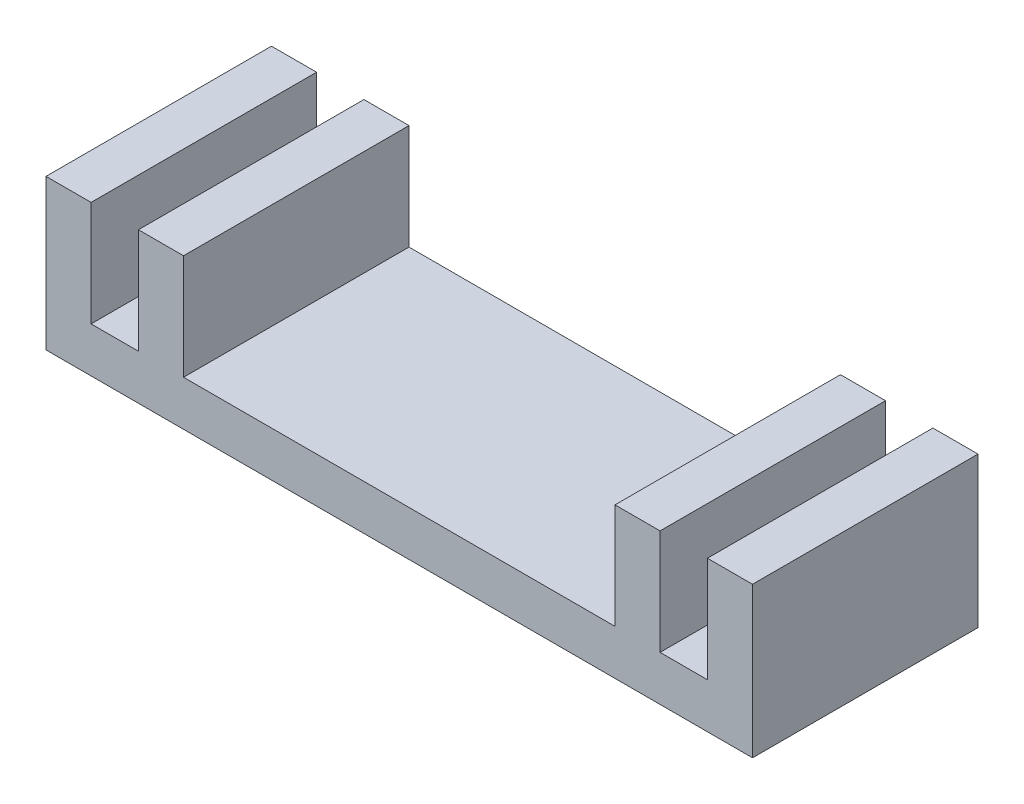
ISO-10303-21;
HEADER;
FILE_DESCRIPTION(('STEP AP214'),'2;1');
FILE_NAME('part.step','',(''),(''),'','','');
FILE_SCHEMA(('AUTOMOTIVE_DESIGN { 1 0 10303 214 1 1 1 1 }'));
ENDSEC;
DATA;
#1=APPLICATION_CONTEXT('core data for automotive mechanical design processes');
#2=APPLICATION_PROTOCOL_DEFINITION('international standard','automotive_design',2000,#1);
#3=PRODUCT_CONTEXT('',#1,'mechanical');
#4=PRODUCT('Part','Part','',(#3));
#5=PRODUCT_RELATED_PRODUCT_CATEGORY('part','',(#4));
#6=PRODUCT_DEFINITION_FORMATION('','',#4);
#7=PRODUCT_DEFINITION_CONTEXT('part definition',#1,'design');
#8=PRODUCT_DEFINITION('design','',#6,#7);
#9=PRODUCT_DEFINITION_SHAPE('','',#8);
#10=(LENGTH_UNIT() NAMED_UNIT(*) SI_UNIT(.MILLI.,.METRE.));
#11=(NAMED_UNIT(*) PLANE_ANGLE_UNIT() SI_UNIT($,.RADIAN.));
#12=(NAMED_UNIT(*) SI_UNIT($,.STERADIAN.) SOLID_ANGLE_UNIT());
#13=UNCERTAINTY_MEASURE_WITH_UNIT(LENGTH_MEASURE(1.E-05),#10,'distance_accuracy_value','');
#14=(GEOMETRIC_REPRESENTATION_CONTEXT(3) GLOBAL_UNCERTAINTY_ASSIGNED_CONTEXT((#13)) GLOBAL_UNIT_ASSIGNED_CONTEXT((#10,
#11,#12)) REPRESENTATION_CONTEXT('',''));
#15=CARTESIAN_POINT('',(0.,0.,0.));
#16=DIRECTION('',(0.,0.,1.));
#17=DIRECTION('',(1.,0.,0.));
#18=AXIS2_PLACEMENT_3D('',#15,#16,#17);
#19=CARTESIAN_POINT('',(-17.35,9.99999999999999,15.));
#20=DIRECTION('',(0.,-1.,0.));
#21=DIRECTION('',(0.,0.,-1.));
#22=AXIS2_PLACEMENT_3D('',#19,#20,#21);
#23=PLANE('',#22);
#24=DIRECTION('',(-1.,0.,0.));
#25=VECTOR('',#24,1.);
#26=CARTESIAN_POINT('',(-17.35,9.99999999999999,0.));
#27=LINE('',#26,#25);
#28=CARTESIAN_POINT('',(-14.3511570436131,9.99999999999999,0.));
#29=VERTEX_POINT('',#28);
#30=CARTESIAN_POINT('',(-17.35,9.99999999999999,0.));
#31=VERTEX_POINT('',#30);
#32=EDGE_CURVE('E181',#29,#31,#27,.T.);
#33=ORIENTED_EDGE('',*,*,#32,.T.);
#34=DIRECTION('',(0.,0.,-1.));
#35=VECTOR('',#34,1.);
#36=CARTESIAN_POINT('',(-17.35,9.99999999999999,15.));
#37=LINE('',#36,#35);
#38=CARTESIAN_POINT('',(-17.35,9.99999999999999,15.));
#39=VERTEX_POINT('',#38);
#40=EDGE_CURVE('E11',#39,#31,#37,.T.);
#41=ORIENTED_EDGE('',*,*,#40,.F.);
#42=DIRECTION('',(-1.,0.,0.));
#43=VECTOR('',#42,1.);
#44=CARTESIAN_POINT('',(-17.35,9.99999999999999,15.));
#45=LINE('',#44,#43);
#46=CARTESIAN_POINT('',(-14.3511570436131,9.99999999999999,15.));
#47=VERTEX_POINT('',#46);
#48=EDGE_CURVE('E212',#47,#39,#45,.T.);
#49=ORIENTED_EDGE('',*,*,#48,.F.);
#50=DIRECTION('',(0.,0.,-1.));
#51=VECTOR('',#50,1.);
#52=CARTESIAN_POINT('',(-14.3511570436131,9.99999999999999,15.));
#53=LINE('',#52,#51);
#54=EDGE_CURVE('E177',#47,#29,#53,.T.);
#55=ORIENTED_EDGE('',*,*,#54,.T.);
#56=EDGE_LOOP('',(#33,#41,#49,#55));
#57=FACE_BOUND('',#56,.T.);
#58=ADVANCED_FACE('F37',(#57),#23,.F.);
#59=CARTESIAN_POINT('',(-17.35,2.99999999999999,15.));
#60=DIRECTION('',(1.,0.,0.));
#61=DIRECTION('',(0.,0.,-1.));
#62=AXIS2_PLACEMENT_3D('',#59,#60,#61);
#63=PLANE('',#62);
#64=DIRECTION('',(0.,-1.,0.));
#65=VECTOR('',#64,1.);
#66=CARTESIAN_POINT('',(-17.35,2.99999999999999,0.));
#67=LINE('',#66,#65);
#68=CARTESIAN_POINT('',(-17.35,2.99999999999999,0.));
#69=VERTEX_POINT('',#68);
#70=EDGE_CURVE('E184',#31,#69,#67,.T.);
#71=ORIENTED_EDGE('',*,*,#70,.T.);
#72=DIRECTION('',(0.,0.,-1.));
#73=VECTOR('',#72,1.);
#74=CARTESIAN_POINT('',(-17.35,2.99999999999999,15.));
#75=LINE('',#74,#73);
#76=CARTESIAN_POINT('',(-17.35,2.99999999999999,15.));
#77=VERTEX_POINT('',#76);
#78=EDGE_CURVE('E45',#77,#69,#75,.T.);
#79=ORIENTED_EDGE('',*,*,#78,.F.);
#80=DIRECTION('',(0.,-1.,0.));
#81=VECTOR('',#80,1.);
#82=CARTESIAN_POINT('',(-17.35,2.99999999999999,15.));
#83=LINE('',#82,#81);
#84=EDGE_CURVE('E120',#39,#77,#83,.T.);
#85=ORIENTED_EDGE('',*,*,#84,.F.);
#86=ORIENTED_EDGE('',*,*,#40,.T.);
#87=EDGE_LOOP('',(#71,#79,#85,#86));
#88=FACE_BOUND('',#87,.T.);
#89=ADVANCED_FACE('F310',(#88),#63,.F.);
#90=CARTESIAN_POINT('',(-20.5,3.,15.));
#91=DIRECTION('',(0.,-1.,0.));
#92=DIRECTION('',(1.,0.,0.));
#93=AXIS2_PLACEMENT_3D('',#90,#91,#92);
#94=PLANE('',#93);
#95=DIRECTION('',(-1.,0.,0.));
#96=VECTOR('',#95,1.);
#97=CARTESIAN_POINT('',(-20.5,3.,0.));
#98=LINE('',#97,#96);
#99=CARTESIAN_POINT('',(-20.5,3.,0.));
#100=VERTEX_POINT('',#99);
#101=EDGE_CURVE('E186',#69,#100,#98,.T.);
#102=ORIENTED_EDGE('',*,*,#101,.T.);
#103=DIRECTION('',(0.,0.,-1.));
#104=VECTOR('',#103,1.);
#105=CARTESIAN_POINT('',(-20.5,3.,15.));
#106=LINE('',#105,#104);
#107=CARTESIAN_POINT('',(-20.5,3.,15.));
#108=VERTEX_POINT('',#107);
#109=EDGE_CURVE('E243',#108,#100,#106,.T.);
#110=ORIENTED_EDGE('',*,*,#109,.F.);
#111=DIRECTION('',(-1.,0.,0.));
#112=VECTOR('',#111,1.);
#113=CARTESIAN_POINT('',(-20.5,3.,15.));
#114=LINE('',#113,#112);
#115=EDGE_CURVE('E251',#77,#108,#114,.T.);
#116=ORIENTED_EDGE('',*,*,#115,.F.);
#117=ORIENTED_EDGE('',*,*,#78,.T.);
#118=EDGE_LOOP('',(#102,#110,#116,#117));
#119=FACE_BOUND('',#118,.T.);
#120=ADVANCED_FACE('F249',(#119),#94,.F.);
#121=CARTESIAN_POINT('',(-20.5,10.,15.));
#122=DIRECTION('',(-1.,0.,0.));
#123=DIRECTION('',(0.,0.,1.));
#124=AXIS2_PLACEMENT_3D('',#121,#122,#123);
#125=PLANE('',#124);
#126=DIRECTION('',(0.,1.,0.));
#127=VECTOR('',#126,1.);
#128=CARTESIAN_POINT('',(-20.5,10.,0.));
#129=LINE('',#128,#127);
#130=CARTESIAN_POINT('',(-20.5,10.,0.));
#131=VERTEX_POINT('',#130);
#132=EDGE_CURVE('E188',#100,#131,#129,.T.);
#133=ORIENTED_EDGE('',*,*,#132,.T.);
#134=DIRECTION('',(0.,0.,-1.));
#135=VECTOR('',#134,1.);
#136=CARTESIAN_POINT('',(-20.5,10.,15.));
#137=LINE('',#136,#135);
#138=CARTESIAN_POINT('',(-20.5,10.,15.));
#139=VERTEX_POINT('',#138);
#140=EDGE_CURVE('E240',#139,#131,#137,.T.);
#141=ORIENTED_EDGE('',*,*,#140,.F.);
#142=DIRECTION('',(0.,1.,0.));
#143=VECTOR('',#142,1.);
#144=CARTESIAN_POINT('',(-20.5,10.,15.));
#145=LINE('',#144,#143);
#146=EDGE_CURVE('E269',#108,#139,#145,.T.);
#147=ORIENTED_EDGE('',*,*,#146,.F.);
#148=ORIENTED_EDGE('',*,*,#109,.T.);
#149=EDGE_LOOP('',(#133,#141,#147,#148));
#150=FACE_BOUND('',#149,.T.);
#151=ADVANCED_FACE('F260',(#150),#125,.F.);
#152=CARTESIAN_POINT('',(-23.5,10.,15.));
#153=DIRECTION('',(0.,-1.,0.));
#154=DIRECTION('',(0.,0.,-1.));
#155=AXIS2_PLACEMENT_3D('',#152,#153,#154);
#156=PLANE('',#155);
#157=DIRECTION('',(-1.,0.,0.));
#158=VECTOR('',#157,1.);
#159=CARTESIAN_POINT('',(-23.5,10.,0.));
#160=LINE('',#159,#158);
#161=CARTESIAN_POINT('',(-23.5,10.,0.));
#162=VERTEX_POINT('',#161);
#163=EDGE_CURVE('E190',#131,#162,#160,.T.);
#164=ORIENTED_EDGE('',*,*,#163,.T.);
#165=DIRECTION('',(0.,0.,-1.));
#166=VECTOR('',#165,1.);
#167=CARTESIAN_POINT('',(-23.5,10.,15.));
#168=LINE('',#167,#166);
#169=CARTESIAN_POINT('',(-23.5,10.,15.));
#170=VERTEX_POINT('',#169);
#171=EDGE_CURVE('E237',#170,#162,#168,.T.);
#172=ORIENTED_EDGE('',*,*,#171,.F.);
#173=DIRECTION('',(-1.,0.,0.));
#174=VECTOR('',#173,1.);
#175=CARTESIAN_POINT('',(-23.5,10.,15.));
#176=LINE('',#175,#174);
#177=EDGE_CURVE('E266',#139,#170,#176,.T.);
#178=ORIENTED_EDGE('',*,*,#177,.F.);
#179=ORIENTED_EDGE('',*,*,#140,.T.);
#180=EDGE_LOOP('',(#164,#172,#178,#179));
#181=FACE_BOUND('',#180,.T.);
#182=ADVANCED_FACE('F264',(#181),#156,.F.);
#183=CARTESIAN_POINT('',(-23.5,0.,15.));
#184=DIRECTION('',(1.,0.,0.));
#185=DIRECTION('',(0.,0.,-1.));
#186=AXIS2_PLACEMENT_3D('',#183,#184,#185);
#187=PLANE('',#186);
#188=DIRECTION('',(0.,-1.,0.));
#189=VECTOR('',#188,1.);
#190=CARTESIAN_POINT('',(-23.5,0.,0.));
#191=LINE('',#190,#189);
#192=CARTESIAN_POINT('',(-23.5,0.,0.));
#193=VERTEX_POINT('',#192);
#194=EDGE_CURVE('E192',#162,#193,#191,.T.);
#195=ORIENTED_EDGE('',*,*,#194,.T.);
#196=DIRECTION('',(0.,0.,-1.));
#197=VECTOR('',#196,1.);
#198=CARTESIAN_POINT('',(-23.5,0.,15.));
#199=LINE('',#198,#197);
#200=CARTESIAN_POINT('',(-23.5,0.,15.));
#201=VERTEX_POINT('',#200);
#202=EDGE_CURVE('E234',#201,#193,#199,.T.);
#203=ORIENTED_EDGE('',*,*,#202,.F.);
#204=DIRECTION('',(0.,-1.,0.));
#205=VECTOR('',#204,1.);
#206=CARTESIAN_POINT('',(-23.5,0.,15.));
#207=LINE('',#206,#205);
#208=EDGE_CURVE('E268',#170,#201,#207,.T.);
#209=ORIENTED_EDGE('',*,*,#208,.F.);
#210=ORIENTED_EDGE('',*,*,#171,.T.);
#211=EDGE_LOOP('',(#195,#203,#209,#210));
#212=FACE_BOUND('',#211,.T.);
#213=ADVANCED_FACE('F323',(#212),#187,.F.);
#214=CARTESIAN_POINT('',(20.5,0.,15.));
#215=DIRECTION('',(0.,1.,0.));
#216=DIRECTION('',(-1.,0.,0.));
#217=AXIS2_PLACEMENT_3D('',#214,#215,#216);
#218=PLANE('',#217);
#219=DIRECTION('',(1.,0.,0.));
#220=VECTOR('',#219,1.);
#221=CARTESIAN_POINT('',(20.5,0.,0.));
#222=LINE('',#221,#220);
#223=CARTESIAN_POINT('',(23.5,0.,0.));
#224=VERTEX_POINT('',#223);
#225=EDGE_CURVE('E195',#193,#224,#222,.T.);
#226=ORIENTED_EDGE('',*,*,#225,.T.);
#227=DIRECTION('',(0.,0.,-1.));
#228=VECTOR('',#227,1.);
#229=CARTESIAN_POINT('',(23.5,0.,15.));
#230=LINE('',#229,#228);
#231=CARTESIAN_POINT('',(23.5,0.,15.));
#232=VERTEX_POINT('',#231);
#233=EDGE_CURVE('E231',#232,#224,#230,.T.);
#234=ORIENTED_EDGE('',*,*,#233,.F.);
#235=DIRECTION('',(1.,0.,0.));
#236=VECTOR('',#235,1.);
#237=CARTESIAN_POINT('',(-20.5,0.,15.));
#238=LINE('',#237,#236);
#239=EDGE_CURVE('E271',#201,#232,#238,.T.);
#240=ORIENTED_EDGE('',*,*,#239,.F.);
#241=ORIENTED_EDGE('',*,*,#202,.T.);
#242=EDGE_LOOP('',(#226,#234,#240,#241));
#243=FACE_BOUND('',#242,.T.);
#244=ADVANCED_FACE('F326',(#243),#218,.F.);
#245=CARTESIAN_POINT('',(23.5,0.,15.));
#246=DIRECTION('',(-1.,0.,0.));
#247=DIRECTION('',(0.,0.,1.));
#248=AXIS2_PLACEMENT_3D('',#245,#246,#247);
#249=PLANE('',#248);
#250=DIRECTION('',(0.,1.,0.));
#251=VECTOR('',#250,1.);
#252=CARTESIAN_POINT('',(23.5,0.,0.));
#253=LINE('',#252,#251);
#254=CARTESIAN_POINT('',(23.5,10.,0.));
#255=VERTEX_POINT('',#254);
#256=EDGE_CURVE('E197',#224,#255,#253,.T.);
#257=ORIENTED_EDGE('',*,*,#256,.T.);
#258=DIRECTION('',(0.,0.,-1.));
#259=VECTOR('',#258,1.);
#260=CARTESIAN_POINT('',(23.5,10.,15.));
#261=LINE('',#260,#259);
#262=CARTESIAN_POINT('',(23.5,10.,15.));
#263=VERTEX_POINT('',#262);
#264=EDGE_CURVE('E228',#263,#255,#261,.T.);
#265=ORIENTED_EDGE('',*,*,#264,.F.);
#266=DIRECTION('',(0.,1.,0.));
#267=VECTOR('',#266,1.);
#268=CARTESIAN_POINT('',(23.5,0.,15.));
#269=LINE('',#268,#267);
#270=EDGE_CURVE('E277',#232,#263,#269,.T.);
#271=ORIENTED_EDGE('',*,*,#270,.F.);
#272=ORIENTED_EDGE('',*,*,#233,.T.);
#273=EDGE_LOOP('',(#257,#265,#271,#272));
#274=FACE_BOUND('',#273,.T.);
#275=ADVANCED_FACE('F330',(#274),#249,.F.);
#276=CARTESIAN_POINT('',(23.5,10.,15.));
#277=DIRECTION('',(0.,-1.,0.));
#278=DIRECTION('',(0.,0.,-1.));
#279=AXIS2_PLACEMENT_3D('',#276,#277,#278);
#280=PLANE('',#279);
#281=DIRECTION('',(-1.,0.,0.));
#282=VECTOR('',#281,1.);
#283=CARTESIAN_POINT('',(23.5,10.,0.));
#284=LINE('',#283,#282);
#285=CARTESIAN_POINT('',(20.5,10.,0.));
#286=VERTEX_POINT('',#285);
#287=EDGE_CURVE('E199',#255,#286,#284,.T.);
#288=ORIENTED_EDGE('',*,*,#287,.T.);
#289=DIRECTION('',(0.,0.,-1.));
#290=VECTOR('',#289,1.);
#291=CARTESIAN_POINT('',(20.5,10.,15.));
#292=LINE('',#291,#290);
#293=CARTESIAN_POINT('',(20.5,10.,15.));
#294=VERTEX_POINT('',#293);
#295=EDGE_CURVE('E225',#294,#286,#292,.T.);
#296=ORIENTED_EDGE('',*,*,#295,.F.);
#297=DIRECTION('',(-1.,0.,0.));
#298=VECTOR('',#297,1.);
#299=CARTESIAN_POINT('',(23.5,10.,15.));
#300=LINE('',#299,#298);
#301=EDGE_CURVE('E279',#263,#294,#300,.T.);
#302=ORIENTED_EDGE('',*,*,#301,.F.);
#303=ORIENTED_EDGE('',*,*,#264,.T.);
#304=EDGE_LOOP('',(#288,#296,#302,#303));
#305=FACE_BOUND('',#304,.T.);
#306=ADVANCED_FACE('F334',(#305),#280,.F.);
#307=CARTESIAN_POINT('',(20.5,10.,15.));
#308=DIRECTION('',(1.,0.,0.));
#309=DIRECTION('',(0.,0.,-1.));
#310=AXIS2_PLACEMENT_3D('',#307,#308,#309);
#311=PLANE('',#310);
#312=DIRECTION('',(0.,-1.,0.));
#313=VECTOR('',#312,1.);
#314=CARTESIAN_POINT('',(20.5,10.,0.));
#315=LINE('',#314,#313);
#316=CARTESIAN_POINT('',(20.5,3.,0.));
#317=VERTEX_POINT('',#316);
#318=EDGE_CURVE('E201',#286,#317,#315,.T.);
#319=ORIENTED_EDGE('',*,*,#318,.T.);
#320=DIRECTION('',(0.,0.,-1.));
#321=VECTOR('',#320,1.);
#322=CARTESIAN_POINT('',(20.5,3.,15.));
#323=LINE('',#322,#321);
#324=CARTESIAN_POINT('',(20.5,3.,15.));
#325=VERTEX_POINT('',#324);
#326=EDGE_CURVE('E222',#325,#317,#323,.T.);
#327=ORIENTED_EDGE('',*,*,#326,.F.);
#328=DIRECTION('',(0.,-1.,0.));
#329=VECTOR('',#328,1.);
#330=CARTESIAN_POINT('',(20.5,10.,15.));
#331=LINE('',#330,#329);
#332=EDGE_CURVE('E281',#294,#325,#331,.T.);
#333=ORIENTED_EDGE('',*,*,#332,.F.);
#334=ORIENTED_EDGE('',*,*,#295,.T.);
#335=EDGE_LOOP('',(#319,#327,#333,#334));
#336=FACE_BOUND('',#335,.T.);
#337=ADVANCED_FACE('F338',(#336),#311,.F.);
#338=CARTESIAN_POINT('',(20.5,3.,15.));
#339=DIRECTION('',(0.,-1.,0.));
#340=DIRECTION('',(1.,0.,0.));
#341=AXIS2_PLACEMENT_3D('',#338,#339,#340);
#342=PLANE('',#341);
#343=DIRECTION('',(-1.,0.,0.));
#344=VECTOR('',#343,1.);
#345=CARTESIAN_POINT('',(20.5,3.,0.));
#346=LINE('',#345,#344);
#347=CARTESIAN_POINT('',(17.35,2.99999999999999,0.));
#348=VERTEX_POINT('',#347);
#349=EDGE_CURVE('E203',#317,#348,#346,.T.);
#350=ORIENTED_EDGE('',*,*,#349,.T.);
#351=DIRECTION('',(0.,0.,-1.));
#352=VECTOR('',#351,1.);
#353=CARTESIAN_POINT('',(17.35,2.99999999999999,15.));
#354=LINE('',#353,#352);
#355=CARTESIAN_POINT('',(17.35,2.99999999999999,15.));
#356=VERTEX_POINT('',#355);
#357=EDGE_CURVE('E219',#356,#348,#354,.T.);
#358=ORIENTED_EDGE('',*,*,#357,.F.);
#359=DIRECTION('',(-1.,0.,0.));
#360=VECTOR('',#359,1.);
#361=CARTESIAN_POINT('',(20.5,3.,15.));
#362=LINE('',#361,#360);
#363=EDGE_CURVE('E283',#325,#356,#362,.T.);
#364=ORIENTED_EDGE('',*,*,#363,.F.);
#365=ORIENTED_EDGE('',*,*,#326,.T.);
#366=EDGE_LOOP('',(#350,#358,#364,#365));
#367=FACE_BOUND('',#366,.T.);
#368=ADVANCED_FACE('F342',(#367),#342,.F.);
#369=CARTESIAN_POINT('',(17.35,2.99999999999999,15.));
#370=DIRECTION('',(-1.,0.,0.));
#371=DIRECTION('',(0.,0.,1.));
#372=AXIS2_PLACEMENT_3D('',#369,#370,#371);
#373=PLANE('',#372);
#374=DIRECTION('',(0.,1.,0.));
#375=VECTOR('',#374,1.);
#376=CARTESIAN_POINT('',(17.35,2.99999999999999,0.));
#377=LINE('',#376,#375);
#378=CARTESIAN_POINT('',(17.35,9.99999999999999,0.));
#379=VERTEX_POINT('',#378);
#380=EDGE_CURVE('E205',#348,#379,#377,.T.);
#381=ORIENTED_EDGE('',*,*,#380,.T.);
#382=DIRECTION('',(0.,0.,-1.));
#383=VECTOR('',#382,1.);
#384=CARTESIAN_POINT('',(17.35,9.99999999999999,15.));
#385=LINE('',#384,#383);
#386=CARTESIAN_POINT('',(17.35,9.99999999999999,15.));
#387=VERTEX_POINT('',#386);
#388=EDGE_CURVE('E216',#387,#379,#385,.T.);
#389=ORIENTED_EDGE('',*,*,#388,.F.);
#390=DIRECTION('',(0.,1.,0.));
#391=VECTOR('',#390,1.);
#392=CARTESIAN_POINT('',(17.35,2.99999999999999,15.));
#393=LINE('',#392,#391);
#394=EDGE_CURVE('E285',#356,#387,#393,.T.);
#395=ORIENTED_EDGE('',*,*,#394,.F.);
#396=ORIENTED_EDGE('',*,*,#357,.T.);
#397=EDGE_LOOP('',(#381,#389,#395,#396));
#398=FACE_BOUND('',#397,.T.);
#399=ADVANCED_FACE('F291',(#398),#373,.F.);
#400=CARTESIAN_POINT('',(17.35,9.99999999999999,15.));
#401=DIRECTION('',(0.,-1.,0.));
#402=DIRECTION('',(0.,0.,-1.));
#403=AXIS2_PLACEMENT_3D('',#400,#401,#402);
#404=PLANE('',#403);
#405=DIRECTION('',(-1.,0.,0.));
#406=VECTOR('',#405,1.);
#407=CARTESIAN_POINT('',(17.35,9.99999999999999,0.));
#408=LINE('',#407,#406);
#409=CARTESIAN_POINT('',(14.3511570436131,9.99999999999999,0.));
#410=VERTEX_POINT('',#409);
#411=EDGE_CURVE('E207',#379,#410,#408,.T.);
#412=ORIENTED_EDGE('',*,*,#411,.T.);
#413=DIRECTION('',(0.,0.,-1.));
#414=VECTOR('',#413,1.);
#415=CARTESIAN_POINT('',(14.3511570436131,9.99999999999999,15.));
#416=LINE('',#415,#414);
#417=CARTESIAN_POINT('',(14.3511570436131,9.99999999999999,15.));
#418=VERTEX_POINT('',#417);
#419=EDGE_CURVE('E172',#418,#410,#416,.T.);
#420=ORIENTED_EDGE('',*,*,#419,.F.);
#421=DIRECTION('',(-1.,0.,0.));
#422=VECTOR('',#421,1.);
#423=CARTESIAN_POINT('',(17.35,9.99999999999999,15.));
#424=LINE('',#423,#422);
#425=EDGE_CURVE('E163',#387,#418,#424,.T.);
#426=ORIENTED_EDGE('',*,*,#425,.F.);
#427=ORIENTED_EDGE('',*,*,#388,.T.);
#428=EDGE_LOOP('',(#412,#420,#426,#427));
#429=FACE_BOUND('',#428,.T.);
#430=ADVANCED_FACE('F295',(#429),#404,.F.);
#431=CARTESIAN_POINT('',(14.3511570436131,9.99999999999999,15.));
#432=DIRECTION('',(1.,0.,0.));
#433=DIRECTION('',(0.,0.,-1.));
#434=AXIS2_PLACEMENT_3D('',#431,#432,#433);
#435=PLANE('',#434);
#436=DIRECTION('',(0.,-1.,0.));
#437=VECTOR('',#436,1.);
#438=CARTESIAN_POINT('',(14.3511570436131,9.99999999999999,0.));
#439=LINE('',#438,#437);
#440=CARTESIAN_POINT('',(14.3511570436131,2.99999999999999,0.));
#441=VERTEX_POINT('',#440);
#442=EDGE_CURVE('E171',#410,#441,#439,.T.);
#443=ORIENTED_EDGE('',*,*,#442,.T.);
#444=DIRECTION('',(0.,0.,-1.));
#445=VECTOR('',#444,1.);
#446=CARTESIAN_POINT('',(14.3511570436131,2.99999999999999,15.));
#447=LINE('',#446,#445);
#448=CARTESIAN_POINT('',(14.3511570436131,2.99999999999999,15.));
#449=VERTEX_POINT('',#448);
#450=EDGE_CURVE('E168',#449,#441,#447,.T.);
#451=ORIENTED_EDGE('',*,*,#450,.F.);
#452=DIRECTION('',(0.,-1.,0.));
#453=VECTOR('',#452,1.);
#454=CARTESIAN_POINT('',(14.3511570436131,9.99999999999999,15.));
#455=LINE('',#454,#453);
#456=EDGE_CURVE('E157',#418,#449,#455,.T.);
#457=ORIENTED_EDGE('',*,*,#456,.F.);
#458=ORIENTED_EDGE('',*,*,#419,.T.);
#459=EDGE_LOOP('',(#443,#451,#457,#458));
#460=FACE_BOUND('',#459,.T.);
#461=ADVANCED_FACE('F169',(#460),#435,.F.);
#462=CARTESIAN_POINT('',(-14.3511570436131,2.99999999999999,15.));
#463=DIRECTION('',(0.,-1.,0.));
#464=DIRECTION('',(0.,0.,-1.));
#465=AXIS2_PLACEMENT_3D('',#462,#463,#464);
#466=PLANE('',#465);
#467=DIRECTION('',(-1.,0.,0.));
#468=VECTOR('',#467,1.);
#469=CARTESIAN_POINT('',(-14.3511570436131,2.99999999999999,0.));
#470=LINE('',#469,#468);
#471=CARTESIAN_POINT('',(-14.3511570436131,2.99999999999999,0.));
#472=VERTEX_POINT('',#471);
#473=EDGE_CURVE('E106',#441,#472,#470,.T.);
#474=ORIENTED_EDGE('',*,*,#473,.T.);
#475=DIRECTION('',(0.,0.,-1.));
#476=VECTOR('',#475,1.);
#477=CARTESIAN_POINT('',(-14.3511570436131,2.99999999999999,15.));
#478=LINE('',#477,#476);
#479=CARTESIAN_POINT('',(-14.3511570436131,2.99999999999999,15.));
#480=VERTEX_POINT('',#479);
#481=EDGE_CURVE('E173',#480,#472,#478,.T.);
#482=ORIENTED_EDGE('',*,*,#481,.F.);
#483=DIRECTION('',(-1.,0.,0.));
#484=VECTOR('',#483,1.);
#485=CARTESIAN_POINT('',(-14.3511570436131,2.99999999999999,15.));
#486=LINE('',#485,#484);
#487=EDGE_CURVE('E161',#449,#480,#486,.T.);
#488=ORIENTED_EDGE('',*,*,#487,.F.);
#489=ORIENTED_EDGE('',*,*,#450,.T.);
#490=EDGE_LOOP('',(#474,#482,#488,#489));
#491=FACE_BOUND('',#490,.T.);
#492=ADVANCED_FACE('F175',(#491),#466,.F.);
#493=CARTESIAN_POINT('',(-14.3511570436131,9.99999999999999,15.));
#494=DIRECTION('',(-1.,0.,0.));
#495=DIRECTION('',(0.,0.,1.));
#496=AXIS2_PLACEMENT_3D('',#493,#494,#495);
#497=PLANE('',#496);
#498=DIRECTION('',(0.,1.,0.));
#499=VECTOR('',#498,1.);
#500=CARTESIAN_POINT('',(-14.3511570436131,9.99999999999999,0.));
#501=LINE('',#500,#499);
#502=EDGE_CURVE('E112',#472,#29,#501,.T.);
#503=ORIENTED_EDGE('',*,*,#502,.T.);
#504=ORIENTED_EDGE('',*,*,#54,.F.);
#505=DIRECTION('',(0.,1.,0.));
#506=VECTOR('',#505,1.);
#507=CARTESIAN_POINT('',(-14.3511570436131,9.99999999999999,15.));
#508=LINE('',#507,#506);
#509=EDGE_CURVE('E53',#480,#47,#508,.T.);
#510=ORIENTED_EDGE('',*,*,#509,.F.);
#511=ORIENTED_EDGE('',*,*,#481,.T.);
#512=EDGE_LOOP('',(#503,#504,#510,#511));
#513=FACE_BOUND('',#512,.T.);
#514=ADVANCED_FACE('F299',(#513),#497,.F.);
#515=CARTESIAN_POINT('',(0.,0.,15.));
#516=DIRECTION('',(0.,0.,-1.));
#517=DIRECTION('',(-1.,0.,0.));
#518=AXIS2_PLACEMENT_3D('',#515,#516,#517);
#519=PLANE('',#518);
#520=ORIENTED_EDGE('',*,*,#48,.T.);
#521=ORIENTED_EDGE('',*,*,#84,.T.);
#522=ORIENTED_EDGE('',*,*,#115,.T.);
#523=ORIENTED_EDGE('',*,*,#146,.T.);
#524=ORIENTED_EDGE('',*,*,#177,.T.);
#525=ORIENTED_EDGE('',*,*,#208,.T.);
#526=ORIENTED_EDGE('',*,*,#239,.T.);
#527=ORIENTED_EDGE('',*,*,#270,.T.);
#528=ORIENTED_EDGE('',*,*,#301,.T.);
#529=ORIENTED_EDGE('',*,*,#332,.T.);
#530=ORIENTED_EDGE('',*,*,#363,.T.);
#531=ORIENTED_EDGE('',*,*,#394,.T.);
#532=ORIENTED_EDGE('',*,*,#425,.T.);
#533=ORIENTED_EDGE('',*,*,#456,.T.);
#534=ORIENTED_EDGE('',*,*,#487,.T.);
#535=ORIENTED_EDGE('',*,*,#509,.T.);
#536=EDGE_LOOP('',(#520,#521,#522,#523,#524,#525,#526,#527,#528,#529,#530,#531,#532,#533,#534,#535));
#537=FACE_BOUND('',#536,.T.);
#538=ADVANCED_FACE('F159',(#537),#519,.F.);
#539=CARTESIAN_POINT('',(0.,0.,0.));
#540=DIRECTION('',(0.,0.,-1.));
#541=DIRECTION('',(-1.,0.,0.));
#542=AXIS2_PLACEMENT_3D('',#539,#540,#541);
#543=PLANE('',#542);
#544=ORIENTED_EDGE('',*,*,#32,.F.);
#545=ORIENTED_EDGE('',*,*,#502,.F.);
#546=ORIENTED_EDGE('',*,*,#473,.F.);
#547=ORIENTED_EDGE('',*,*,#442,.F.);
#548=ORIENTED_EDGE('',*,*,#411,.F.);
#549=ORIENTED_EDGE('',*,*,#380,.F.);
#550=ORIENTED_EDGE('',*,*,#349,.F.);
#551=ORIENTED_EDGE('',*,*,#318,.F.);
#552=ORIENTED_EDGE('',*,*,#287,.F.);
#553=ORIENTED_EDGE('',*,*,#256,.F.);
#554=ORIENTED_EDGE('',*,*,#225,.F.);
#555=ORIENTED_EDGE('',*,*,#194,.F.);
#556=ORIENTED_EDGE('',*,*,#163,.F.);
#557=ORIENTED_EDGE('',*,*,#132,.F.);
#558=ORIENTED_EDGE('',*,*,#101,.F.);
#559=ORIENTED_EDGE('',*,*,#70,.F.);
#560=EDGE_LOOP('',(#544,#545,#546,#547,#548,#549,#550,#551,#552,#553,#554,#555,#556,#557,#558,#559));
#561=FACE_BOUND('',#560,.T.);
#562=ADVANCED_FACE('F255',(#561),#543,.T.);
#563=CLOSED_SHELL('',(#58,#89,#120,#151,#182,#213,#244,#275,#306,#337,#368,#399,#430,#461,#492,
#514,#538,#562));
#564=MANIFOLD_SOLID_BREP('B2',#563);
#565=ADVANCED_BREP_SHAPE_REPRESENTATION('',(#18,#564),#14);
#566=SHAPE_DEFINITION_REPRESENTATION(#9,#565);
ENDSEC;
END-ISO-10303-21;
